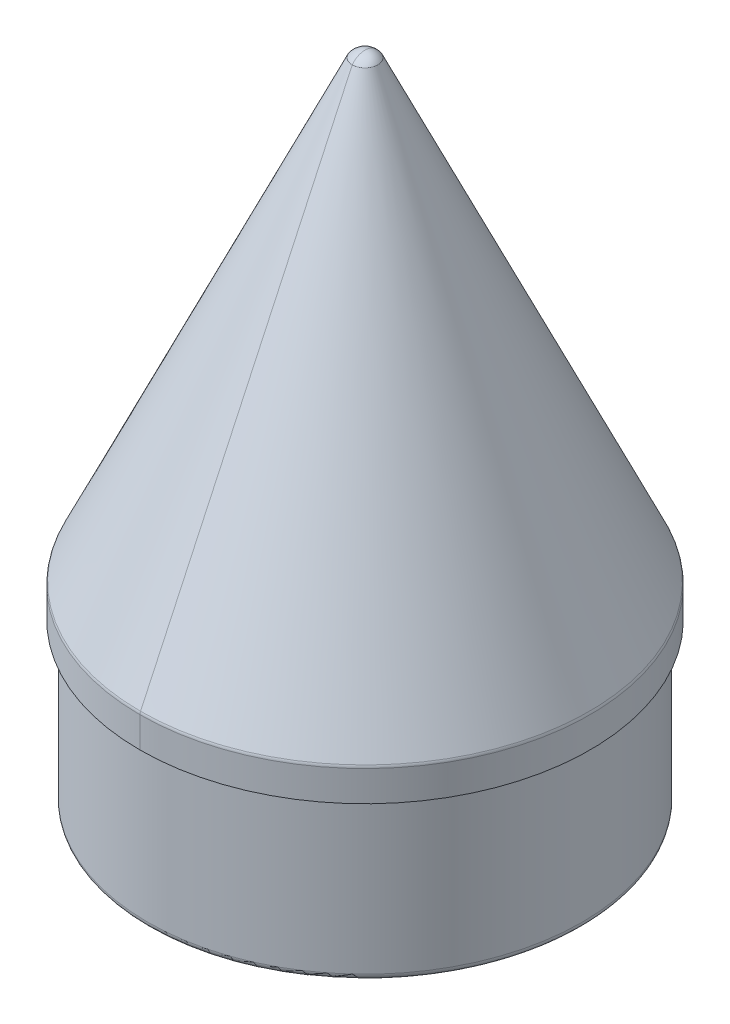
ISO-10303-21;
HEADER;
FILE_DESCRIPTION(('STEP AP214'),'2;1');
FILE_NAME('part.step','',(''),(''),'','','');
FILE_SCHEMA(('AUTOMOTIVE_DESIGN { 1 0 10303 214 1 1 1 1 }'));
ENDSEC;
DATA;
#1=APPLICATION_CONTEXT('core data for automotive mechanical design processes');
#2=APPLICATION_PROTOCOL_DEFINITION('international standard','automotive_design',2000,#1);
#3=PRODUCT_CONTEXT('',#1,'mechanical');
#4=PRODUCT('Part','Part','',(#3));
#5=PRODUCT_RELATED_PRODUCT_CATEGORY('part','',(#4));
#6=PRODUCT_DEFINITION_FORMATION('','',#4);
#7=PRODUCT_DEFINITION_CONTEXT('part definition',#1,'design');
#8=PRODUCT_DEFINITION('design','',#6,#7);
#9=PRODUCT_DEFINITION_SHAPE('','',#8);
#10=(LENGTH_UNIT() NAMED_UNIT(*) SI_UNIT(.MILLI.,.METRE.));
#11=(NAMED_UNIT(*) PLANE_ANGLE_UNIT() SI_UNIT($,.RADIAN.));
#12=(NAMED_UNIT(*) SI_UNIT($,.STERADIAN.) SOLID_ANGLE_UNIT());
#13=UNCERTAINTY_MEASURE_WITH_UNIT(LENGTH_MEASURE(1.E-05),#10,'distance_accuracy_value','');
#14=(GEOMETRIC_REPRESENTATION_CONTEXT(3) GLOBAL_UNCERTAINTY_ASSIGNED_CONTEXT((#13)) GLOBAL_UNIT_ASSIGNED_CONTEXT((#10,
#11,#12)) REPRESENTATION_CONTEXT('',''));
#15=CARTESIAN_POINT('',(0.,0.,0.));
#16=DIRECTION('',(0.,0.,1.));
#17=DIRECTION('',(1.,0.,0.));
#18=AXIS2_PLACEMENT_3D('',#15,#16,#17);
#19=CARTESIAN_POINT('',(0.,0.,0.));
#20=DIRECTION('',(1.,0.,0.));
#21=DIRECTION('',(0.,0.,-1.));
#22=AXIS2_PLACEMENT_3D('',#19,#20,#21);
#23=PLANE('',#22);
#24=DIRECTION('',(0.,-1.,0.));
#25=VECTOR('',#24,1.);
#26=CARTESIAN_POINT('',(0.,0.,70.5));
#27=LINE('',#26,#25);
#28=CARTESIAN_POINT('',(0.,0.,70.5));
#29=VERTEX_POINT('',#28);
#30=CARTESIAN_POINT('',(0.,9.55661067471414,70.5));
#31=VERTEX_POINT('',#30);
#32=EDGE_CURVE('E168',#29,#31,#27,.F.);
#33=ORIENTED_EDGE('',*,*,#32,.F.);
#34=DIRECTION('',(0.,0.,1.));
#35=VECTOR('',#34,1.);
#36=CARTESIAN_POINT('',(0.,0.,0.));
#37=LINE('',#36,#35);
#38=CARTESIAN_POINT('',(0.,0.,61.));
#39=VERTEX_POINT('',#38);
#40=EDGE_CURVE('E164',#39,#29,#37,.T.);
#41=ORIENTED_EDGE('',*,*,#40,.F.);
#42=DIRECTION('',(0.,-1.,0.));
#43=VECTOR('',#42,1.);
#44=CARTESIAN_POINT('',(0.,0.,61.));
#45=LINE('',#44,#43);
#46=CARTESIAN_POINT('',(0.,7.,61.));
#47=VERTEX_POINT('',#46);
#48=EDGE_CURVE('E137',#39,#47,#45,.F.);
#49=ORIENTED_EDGE('',*,*,#48,.T.);
#50=DIRECTION('',(0.,0.,1.));
#51=VECTOR('',#50,1.);
#52=CARTESIAN_POINT('',(0.,7.,0.));
#53=LINE('',#52,#51);
#54=CARTESIAN_POINT('',(0.,7.,63.5));
#55=VERTEX_POINT('',#54);
#56=EDGE_CURVE('E135',#47,#55,#53,.T.);
#57=ORIENTED_EDGE('',*,*,#56,.T.);
#58=DIRECTION('',(0.,-1.,0.));
#59=VECTOR('',#58,1.);
#60=CARTESIAN_POINT('',(0.,0.,63.5));
#61=LINE('',#60,#59);
#62=CARTESIAN_POINT('',(0.,8.44813736149946,63.5));
#63=VERTEX_POINT('',#62);
#64=EDGE_CURVE('E122',#55,#63,#61,.F.);
#65=ORIENTED_EDGE('',*,*,#64,.T.);
#66=DIRECTION('',(0.,-0.906307787036652,0.422618261740694));
#67=VECTOR('',#66,1.);
#68=CARTESIAN_POINT('',(0.,144.624326813859,0.));
#69=LINE('',#68,#67);
#70=CARTESIAN_POINT('',(0.,144.624326813859,0.));
#71=VERTEX_POINT('',#70);
#72=EDGE_CURVE('E115',#63,#71,#69,.F.);
#73=ORIENTED_EDGE('',*,*,#72,.T.);
#74=DIRECTION('',(0.,0.906307787036652,0.422618261740694));
#75=VECTOR('',#74,1.);
#76=CARTESIAN_POINT('',(0.,144.624326813859,0.));
#77=LINE('',#76,#75);
#78=CARTESIAN_POINT('',(0.,8.44813736149946,-63.5));
#79=VERTEX_POINT('',#78);
#80=EDGE_CURVE('E118',#71,#79,#77,.F.);
#81=ORIENTED_EDGE('',*,*,#80,.T.);
#82=DIRECTION('',(0.,-1.,0.));
#83=VECTOR('',#82,1.);
#84=CARTESIAN_POINT('',(0.,0.,-63.5));
#85=LINE('',#84,#83);
#86=CARTESIAN_POINT('',(0.,7.,-63.5));
#87=VERTEX_POINT('',#86);
#88=EDGE_CURVE('E129',#79,#87,#85,.T.);
#89=ORIENTED_EDGE('',*,*,#88,.T.);
#90=CARTESIAN_POINT('',(0.,7.,-61.));
#91=VERTEX_POINT('',#90);
#92=EDGE_CURVE('E134',#87,#91,#53,.T.);
#93=ORIENTED_EDGE('',*,*,#92,.T.);
#94=DIRECTION('',(0.,-1.,0.));
#95=VECTOR('',#94,1.);
#96=CARTESIAN_POINT('',(0.,0.,-61.));
#97=LINE('',#96,#95);
#98=CARTESIAN_POINT('',(0.,0.,-61.));
#99=VERTEX_POINT('',#98);
#100=EDGE_CURVE('E140',#91,#99,#97,.T.);
#101=ORIENTED_EDGE('',*,*,#100,.T.);
#102=CARTESIAN_POINT('',(0.,0.,-70.5));
#103=VERTEX_POINT('',#102);
#104=EDGE_CURVE('E124',#103,#99,#37,.T.);
#105=ORIENTED_EDGE('',*,*,#104,.F.);
#106=DIRECTION('',(0.,-1.,0.));
#107=VECTOR('',#106,1.);
#108=CARTESIAN_POINT('',(0.,0.,-70.5));
#109=LINE('',#108,#107);
#110=CARTESIAN_POINT('',(0.,9.55661067471414,-70.5));
#111=VERTEX_POINT('',#110);
#112=EDGE_CURVE('E171',#111,#103,#109,.T.);
#113=ORIENTED_EDGE('',*,*,#112,.F.);
#114=CARTESIAN_POINT('',(0.,9.55661067471414,-68.5));
#115=DIRECTION('',(1.,0.,0.));
#116=DIRECTION('',(0.,0.,-1.));
#117=AXIS2_PLACEMENT_3D('',#114,#115,#116);
#118=CIRCLE('',#117,2.);
#119=CARTESIAN_POINT('',(0.,10.4018471981955,-70.3126155740733));
#120=VERTEX_POINT('',#119);
#121=EDGE_CURVE('E181',#120,#111,#118,.F.);
#122=ORIENTED_EDGE('',*,*,#121,.F.);
#123=DIRECTION('',(0.,0.906307787036652,0.422618261740694));
#124=VECTOR('',#123,1.);
#125=CARTESIAN_POINT('',(0.,161.187737895926,0.));
#126=LINE('',#125,#124);
#127=CARTESIAN_POINT('',(0.,152.609710213888,-4.));
#128=VERTEX_POINT('',#127);
#129=EDGE_CURVE('E185',#128,#120,#126,.F.);
#130=ORIENTED_EDGE('',*,*,#129,.F.);
#131=CARTESIAN_POINT('',(0.,149.609710213888,0.));
#132=DIRECTION('',(1.,0.,0.));
#133=DIRECTION('',(0.,0.,-1.));
#134=AXIS2_PLACEMENT_3D('',#131,#132,#133);
#135=CIRCLE('',#134,5.00000000000003);
#136=CARTESIAN_POINT('',(0.,152.609710213888,4.));
#137=VERTEX_POINT('',#136);
#138=EDGE_CURVE('E64',#137,#128,#135,.F.);
#139=ORIENTED_EDGE('',*,*,#138,.F.);
#140=DIRECTION('',(0.,-0.906307787036652,0.422618261740694));
#141=VECTOR('',#140,1.);
#142=CARTESIAN_POINT('',(0.,161.187737895926,0.));
#143=LINE('',#142,#141);
#144=CARTESIAN_POINT('',(0.,10.4018471981955,70.3126155740733));
#145=VERTEX_POINT('',#144);
#146=EDGE_CURVE('E183',#145,#137,#143,.F.);
#147=ORIENTED_EDGE('',*,*,#146,.F.);
#148=CARTESIAN_POINT('',(0.,9.55661067471414,68.5));
#149=DIRECTION('',(1.,0.,0.));
#150=DIRECTION('',(0.,0.,-1.));
#151=AXIS2_PLACEMENT_3D('',#148,#149,#150);
#152=CIRCLE('',#151,2.);
#153=EDGE_CURVE('E173',#31,#145,#152,.F.);
#154=ORIENTED_EDGE('',*,*,#153,.F.);
#155=EDGE_LOOP('',(#33,#41,#49,#57,#65,#73,#81,#89,#93,#101,#105,#113,#122,#130,#139,#147,#154));
#156=FACE_BOUND('',#155,.T.);
#157=ADVANCED_FACE('F50',(#156),#23,.T.);
#158=CARTESIAN_POINT('',(0.,0.,0.));
#159=DIRECTION('',(0.,-1.,0.));
#160=DIRECTION('',(0.,0.,-1.));
#161=AXIS2_PLACEMENT_3D('',#158,#159,#160);
#162=PLANE('',#161);
#163=CARTESIAN_POINT('',(0.,0.,0.));
#164=DIRECTION('',(0.,-1.,0.));
#165=DIRECTION('',(0.,0.,-1.));
#166=AXIS2_PLACEMENT_3D('',#163,#164,#165);
#167=CIRCLE('',#166,70.5);
#168=EDGE_CURVE('E58',#29,#103,#167,.T.);
#169=ORIENTED_EDGE('',*,*,#168,.T.);
#170=ORIENTED_EDGE('',*,*,#104,.T.);
#171=CARTESIAN_POINT('',(0.,0.,0.));
#172=DIRECTION('',(0.,-1.,0.));
#173=DIRECTION('',(0.,0.,-1.));
#174=AXIS2_PLACEMENT_3D('',#171,#172,#173);
#175=CIRCLE('',#174,61.);
#176=EDGE_CURVE('E13',#99,#39,#175,.F.);
#177=ORIENTED_EDGE('',*,*,#176,.T.);
#178=ORIENTED_EDGE('',*,*,#40,.T.);
#179=EDGE_LOOP('',(#169,#170,#177,#178));
#180=FACE_BOUND('',#179,.T.);
#181=ADVANCED_FACE('F161',(#180),#162,.T.);
#182=CARTESIAN_POINT('',(0.,0.,0.));
#183=DIRECTION('',(0.,-1.,0.));
#184=DIRECTION('',(0.,0.,-1.));
#185=AXIS2_PLACEMENT_3D('',#182,#183,#184);
#186=CYLINDRICAL_SURFACE('',#185,70.5);
#187=ORIENTED_EDGE('',*,*,#168,.F.);
#188=ORIENTED_EDGE('',*,*,#32,.T.);
#189=CARTESIAN_POINT('',(0.,9.55661067471414,0.));
#190=DIRECTION('',(0.,-1.,0.));
#191=DIRECTION('',(0.,0.,-1.));
#192=AXIS2_PLACEMENT_3D('',#189,#190,#191);
#193=CIRCLE('',#192,70.5);
#194=EDGE_CURVE('E154',#31,#111,#193,.T.);
#195=ORIENTED_EDGE('',*,*,#194,.T.);
#196=ORIENTED_EDGE('',*,*,#112,.T.);
#197=EDGE_LOOP('',(#187,#188,#195,#196));
#198=FACE_BOUND('',#197,.T.);
#199=ADVANCED_FACE('F167',(#198),#186,.T.);
#200=CARTESIAN_POINT('',(0.,9.55661067471414,0.));
#201=DIRECTION('',(0.,-1.,0.));
#202=DIRECTION('',(0.,0.,-1.));
#203=AXIS2_PLACEMENT_3D('',#200,#201,#202);
#204=TOROIDAL_SURFACE('',#203,68.5,2.);
#205=ORIENTED_EDGE('',*,*,#194,.F.);
#206=ORIENTED_EDGE('',*,*,#153,.T.);
#207=CARTESIAN_POINT('',(0.,10.4018471981955,0.));
#208=DIRECTION('',(0.,-1.,0.));
#209=DIRECTION('',(0.,0.,-1.));
#210=AXIS2_PLACEMENT_3D('',#207,#208,#209);
#211=CIRCLE('',#210,70.3126155740733);
#212=EDGE_CURVE('E151',#145,#120,#211,.T.);
#213=ORIENTED_EDGE('',*,*,#212,.T.);
#214=ORIENTED_EDGE('',*,*,#121,.T.);
#215=EDGE_LOOP('',(#205,#206,#213,#214));
#216=FACE_BOUND('',#215,.T.);
#217=ADVANCED_FACE('F191',(#216),#204,.T.);
#218=CARTESIAN_POINT('',(0.,10.4018471981955,0.));
#219=DIRECTION('',(0.,-1.,0.));
#220=DIRECTION('',(0.,0.,-1.));
#221=AXIS2_PLACEMENT_3D('',#218,#219,#220);
#222=CONICAL_SURFACE('',#221,70.3126155740733,0.436332312998576);
#223=ORIENTED_EDGE('',*,*,#212,.F.);
#224=ORIENTED_EDGE('',*,*,#146,.T.);
#225=CARTESIAN_POINT('',(0.,152.609710213888,0.));
#226=DIRECTION('',(0.,-1.,0.));
#227=DIRECTION('',(0.,0.,-1.));
#228=AXIS2_PLACEMENT_3D('',#225,#226,#227);
#229=CIRCLE('',#228,4.);
#230=EDGE_CURVE('E148',#137,#128,#229,.T.);
#231=ORIENTED_EDGE('',*,*,#230,.T.);
#232=ORIENTED_EDGE('',*,*,#129,.T.);
#233=EDGE_LOOP('',(#223,#224,#231,#232));
#234=FACE_BOUND('',#233,.T.);
#235=ADVANCED_FACE('F189',(#234),#222,.T.);
#236=CARTESIAN_POINT('',(0.,149.609710213888,0.));
#237=DIRECTION('',(0.,-1.,0.));
#238=DIRECTION('',(1.,0.,0.));
#239=AXIS2_PLACEMENT_3D('',#236,#237,#238);
#240=SPHERICAL_SURFACE('',#239,5.00000000000003);
#241=ORIENTED_EDGE('',*,*,#230,.F.);
#242=ORIENTED_EDGE('',*,*,#138,.T.);
#243=EDGE_LOOP('',(#241,#242));
#244=FACE_BOUND('',#243,.T.);
#245=ADVANCED_FACE('F52',(#244),#240,.T.);
#246=CARTESIAN_POINT('',(0.,7.44351936601067,0.));
#247=DIRECTION('',(0.,-1.,0.));
#248=DIRECTION('',(0.,0.,-1.));
#249=AXIS2_PLACEMENT_3D('',#246,#247,#248);
#250=CONICAL_SURFACE('',#249,63.9684610648167,0.436332312998576);
#251=ORIENTED_EDGE('',*,*,#72,.F.);
#252=CARTESIAN_POINT('',(0.,8.44813736149946,0.));
#253=DIRECTION('',(0.,-1.,0.));
#254=DIRECTION('',(0.,0.,-1.));
#255=AXIS2_PLACEMENT_3D('',#252,#253,#254);
#256=CIRCLE('',#255,63.5);
#257=EDGE_CURVE('E127',#63,#79,#256,.T.);
#258=ORIENTED_EDGE('',*,*,#257,.T.);
#259=ORIENTED_EDGE('',*,*,#80,.F.);
#260=EDGE_LOOP('',(#251,#258,#259));
#261=FACE_BOUND('',#260,.T.);
#262=ADVANCED_FACE('F126',(#261),#250,.F.);
#263=CARTESIAN_POINT('',(0.,0.,0.));
#264=DIRECTION('',(0.,-1.,0.));
#265=DIRECTION('',(0.,0.,-1.));
#266=AXIS2_PLACEMENT_3D('',#263,#264,#265);
#267=CYLINDRICAL_SURFACE('',#266,63.5);
#268=ORIENTED_EDGE('',*,*,#64,.F.);
#269=CARTESIAN_POINT('',(0.,7.,0.));
#270=DIRECTION('',(0.,-1.,0.));
#271=DIRECTION('',(0.,0.,-1.));
#272=AXIS2_PLACEMENT_3D('',#269,#270,#271);
#273=CIRCLE('',#272,63.5);
#274=EDGE_CURVE('E144',#55,#87,#273,.T.);
#275=ORIENTED_EDGE('',*,*,#274,.T.);
#276=ORIENTED_EDGE('',*,*,#88,.F.);
#277=ORIENTED_EDGE('',*,*,#257,.F.);
#278=EDGE_LOOP('',(#268,#275,#276,#277));
#279=FACE_BOUND('',#278,.T.);
#280=ADVANCED_FACE('F197',(#279),#267,.F.);
#281=CARTESIAN_POINT('',(68.,7.,0.));
#282=DIRECTION('',(0.,-1.,0.));
#283=DIRECTION('',(0.,0.,-1.));
#284=AXIS2_PLACEMENT_3D('',#281,#282,#283);
#285=PLANE('',#284);
#286=ORIENTED_EDGE('',*,*,#92,.F.);
#287=ORIENTED_EDGE('',*,*,#274,.F.);
#288=ORIENTED_EDGE('',*,*,#56,.F.);
#289=CARTESIAN_POINT('',(0.,7.,0.));
#290=DIRECTION('',(0.,-1.,0.));
#291=DIRECTION('',(0.,0.,-1.));
#292=AXIS2_PLACEMENT_3D('',#289,#290,#291);
#293=CIRCLE('',#292,61.);
#294=EDGE_CURVE('E146',#47,#91,#293,.T.);
#295=ORIENTED_EDGE('',*,*,#294,.T.);
#296=EDGE_LOOP('',(#286,#287,#288,#295));
#297=FACE_BOUND('',#296,.T.);
#298=ADVANCED_FACE('F210',(#297),#285,.F.);
#299=CARTESIAN_POINT('',(0.,0.,0.));
#300=DIRECTION('',(0.,-1.,0.));
#301=DIRECTION('',(0.,0.,-1.));
#302=AXIS2_PLACEMENT_3D('',#299,#300,#301);
#303=CYLINDRICAL_SURFACE('',#302,61.);
#304=ORIENTED_EDGE('',*,*,#48,.F.);
#305=ORIENTED_EDGE('',*,*,#176,.F.);
#306=ORIENTED_EDGE('',*,*,#100,.F.);
#307=ORIENTED_EDGE('',*,*,#294,.F.);
#308=EDGE_LOOP('',(#304,#305,#306,#307));
#309=FACE_BOUND('',#308,.T.);
#310=ADVANCED_FACE('F207',(#309),#303,.F.);
#311=CLOSED_SHELL('',(#157,#181,#199,#217,#235,#245,#262,#280,#298,#310));
#312=MANIFOLD_SOLID_BREP('B2',#311);
#313=CARTESIAN_POINT('',(0.,0.,0.));
#314=DIRECTION('',(1.,0.,0.));
#315=DIRECTION('',(0.,0.,-1.));
#316=AXIS2_PLACEMENT_3D('',#313,#314,#315);
#317=PLANE('',#316);
#318=DIRECTION('',(0.,-1.,0.));
#319=VECTOR('',#318,1.);
#320=CARTESIAN_POINT('',(0.,0.,70.5));
#321=LINE('',#320,#319);
#322=CARTESIAN_POINT('',(0.,0.,70.5));
#323=VERTEX_POINT('',#322);
#324=CARTESIAN_POINT('',(0.,9.55661067471414,70.5));
#325=VERTEX_POINT('',#324);
#326=EDGE_CURVE('E313',#323,#325,#321,.F.);
#327=ORIENTED_EDGE('',*,*,#326,.T.);
#328=CARTESIAN_POINT('',(0.,9.55661067471414,68.5));
#329=DIRECTION('',(1.,0.,0.));
#330=DIRECTION('',(0.,0.,-1.));
#331=AXIS2_PLACEMENT_3D('',#328,#329,#330);
#332=CIRCLE('',#331,2.);
#333=CARTESIAN_POINT('',(0.,10.4018471981955,70.3126155740733));
#334=VERTEX_POINT('',#333);
#335=EDGE_CURVE('E403',#325,#334,#332,.F.);
#336=ORIENTED_EDGE('',*,*,#335,.T.);
#337=DIRECTION('',(0.,-0.906307787036652,0.422618261740694));
#338=VECTOR('',#337,1.);
#339=CARTESIAN_POINT('',(0.,161.187737895926,0.));
#340=LINE('',#339,#338);
#341=CARTESIAN_POINT('',(0.,152.609710213888,4.));
#342=VERTEX_POINT('',#341);
#343=EDGE_CURVE('E407',#334,#342,#340,.F.);
#344=ORIENTED_EDGE('',*,*,#343,.T.);
#345=CARTESIAN_POINT('',(0.,149.609710213888,0.));
#346=DIRECTION('',(1.,0.,0.));
#347=DIRECTION('',(0.,0.,-1.));
#348=AXIS2_PLACEMENT_3D('',#345,#346,#347);
#349=CIRCLE('',#348,5.00000000000003);
#350=CARTESIAN_POINT('',(0.,152.609710213888,-4.));
#351=VERTEX_POINT('',#350);
#352=EDGE_CURVE('E48',#342,#351,#349,.F.);
#353=ORIENTED_EDGE('',*,*,#352,.T.);
#354=DIRECTION('',(0.,0.906307787036652,0.422618261740694));
#355=VECTOR('',#354,1.);
#356=CARTESIAN_POINT('',(0.,161.187737895926,0.));
#357=LINE('',#356,#355);
#358=CARTESIAN_POINT('',(0.,10.4018471981955,-70.3126155740733));
#359=VERTEX_POINT('',#358);
#360=EDGE_CURVE('E318',#351,#359,#357,.F.);
#361=ORIENTED_EDGE('',*,*,#360,.T.);
#362=CARTESIAN_POINT('',(0.,9.55661067471414,-68.5));
#363=DIRECTION('',(1.,0.,0.));
#364=DIRECTION('',(0.,0.,-1.));
#365=AXIS2_PLACEMENT_3D('',#362,#363,#364);
#366=CIRCLE('',#365,2.);
#367=CARTESIAN_POINT('',(0.,9.55661067471414,-70.5));
#368=VERTEX_POINT('',#367);
#369=EDGE_CURVE('E404',#359,#368,#366,.F.);
#370=ORIENTED_EDGE('',*,*,#369,.T.);
#371=DIRECTION('',(0.,-1.,0.));
#372=VECTOR('',#371,1.);
#373=CARTESIAN_POINT('',(0.,0.,-70.5));
#374=LINE('',#373,#372);
#375=CARTESIAN_POINT('',(0.,0.,-70.5));
#376=VERTEX_POINT('',#375);
#377=EDGE_CURVE('E400',#368,#376,#374,.T.);
#378=ORIENTED_EDGE('',*,*,#377,.T.);
#379=DIRECTION('',(0.,0.,1.));
#380=VECTOR('',#379,1.);
#381=CARTESIAN_POINT('',(0.,0.,0.));
#382=LINE('',#381,#380);
#383=CARTESIAN_POINT('',(0.,0.,-61.));
#384=VERTEX_POINT('',#383);
#385=EDGE_CURVE('E387',#376,#384,#382,.T.);
#386=ORIENTED_EDGE('',*,*,#385,.T.);
#387=DIRECTION('',(0.,-1.,0.));
#388=VECTOR('',#387,1.);
#389=CARTESIAN_POINT('',(0.,0.,-61.));
#390=LINE('',#389,#388);
#391=CARTESIAN_POINT('',(0.,7.,-61.));
#392=VERTEX_POINT('',#391);
#393=EDGE_CURVE('E427',#392,#384,#390,.T.);
#394=ORIENTED_EDGE('',*,*,#393,.F.);
#395=DIRECTION('',(0.,0.,1.));
#396=VECTOR('',#395,1.);
#397=CARTESIAN_POINT('',(0.,7.,0.));
#398=LINE('',#397,#396);
#399=CARTESIAN_POINT('',(0.,7.,-63.5));
#400=VERTEX_POINT('',#399);
#401=EDGE_CURVE('E439',#400,#392,#398,.T.);
#402=ORIENTED_EDGE('',*,*,#401,.F.);
#403=DIRECTION('',(0.,-1.,0.));
#404=VECTOR('',#403,1.);
#405=CARTESIAN_POINT('',(0.,0.,-63.5));
#406=LINE('',#405,#404);
#407=CARTESIAN_POINT('',(0.,8.44813736149946,-63.5));
#408=VERTEX_POINT('',#407);
#409=EDGE_CURVE('E391',#408,#400,#406,.T.);
#410=ORIENTED_EDGE('',*,*,#409,.F.);
#411=DIRECTION('',(0.,0.906307787036652,0.422618261740694));
#412=VECTOR('',#411,1.);
#413=CARTESIAN_POINT('',(0.,144.624326813859,0.));
#414=LINE('',#413,#412);
#415=CARTESIAN_POINT('',(0.,144.624326813859,0.));
#416=VERTEX_POINT('',#415);
#417=EDGE_CURVE('E381',#416,#408,#414,.F.);
#418=ORIENTED_EDGE('',*,*,#417,.F.);
#419=DIRECTION('',(0.,-0.906307787036652,0.422618261740694));
#420=VECTOR('',#419,1.);
#421=CARTESIAN_POINT('',(0.,144.624326813859,0.));
#422=LINE('',#421,#420);
#423=CARTESIAN_POINT('',(0.,8.44813736149946,63.5));
#424=VERTEX_POINT('',#423);
#425=EDGE_CURVE('E378',#424,#416,#422,.F.);
#426=ORIENTED_EDGE('',*,*,#425,.F.);
#427=DIRECTION('',(0.,-1.,0.));
#428=VECTOR('',#427,1.);
#429=CARTESIAN_POINT('',(0.,0.,63.5));
#430=LINE('',#429,#428);
#431=CARTESIAN_POINT('',(0.,7.,63.5));
#432=VERTEX_POINT('',#431);
#433=EDGE_CURVE('E392',#432,#424,#430,.F.);
#434=ORIENTED_EDGE('',*,*,#433,.F.);
#435=CARTESIAN_POINT('',(0.,7.,61.));
#436=VERTEX_POINT('',#435);
#437=EDGE_CURVE('E438',#436,#432,#398,.T.);
#438=ORIENTED_EDGE('',*,*,#437,.F.);
#439=DIRECTION('',(0.,-1.,0.));
#440=VECTOR('',#439,1.);
#441=CARTESIAN_POINT('',(0.,0.,61.));
#442=LINE('',#441,#440);
#443=CARTESIAN_POINT('',(0.,0.,61.));
#444=VERTEX_POINT('',#443);
#445=EDGE_CURVE('E437',#444,#436,#442,.F.);
#446=ORIENTED_EDGE('',*,*,#445,.F.);
#447=EDGE_CURVE('E398',#444,#323,#382,.T.);
#448=ORIENTED_EDGE('',*,*,#447,.T.);
#449=EDGE_LOOP('',(#327,#336,#344,#353,#361,#370,#378,#386,#394,#402,#410,#418,#426,#434,#438,
#446,#448));
#450=FACE_BOUND('',#449,.T.);
#451=ADVANCED_FACE('F310',(#450),#317,.F.);
#452=CARTESIAN_POINT('',(0.,7.44351936601067,0.));
#453=DIRECTION('',(0.,-1.,0.));
#454=DIRECTION('',(0.,0.,-1.));
#455=AXIS2_PLACEMENT_3D('',#452,#453,#454);
#456=CONICAL_SURFACE('',#455,63.9684610648167,0.436332312998576);
#457=CARTESIAN_POINT('',(0.,8.44813736149946,0.));
#458=DIRECTION('',(0.,-1.,0.));
#459=DIRECTION('',(0.,0.,-1.));
#460=AXIS2_PLACEMENT_3D('',#457,#458,#459);
#461=CIRCLE('',#460,63.5);
#462=EDGE_CURVE('E384',#408,#424,#461,.T.);
#463=ORIENTED_EDGE('',*,*,#462,.T.);
#464=ORIENTED_EDGE('',*,*,#425,.T.);
#465=ORIENTED_EDGE('',*,*,#417,.T.);
#466=EDGE_LOOP('',(#463,#464,#465));
#467=FACE_BOUND('',#466,.T.);
#468=ADVANCED_FACE('F380',(#467),#456,.F.);
#469=CARTESIAN_POINT('',(0.,0.,0.));
#470=DIRECTION('',(0.,-1.,0.));
#471=DIRECTION('',(0.,0.,-1.));
#472=AXIS2_PLACEMENT_3D('',#469,#470,#471);
#473=CYLINDRICAL_SURFACE('',#472,63.5);
#474=CARTESIAN_POINT('',(0.,7.,0.));
#475=DIRECTION('',(0.,-1.,0.));
#476=DIRECTION('',(0.,0.,-1.));
#477=AXIS2_PLACEMENT_3D('',#474,#475,#476);
#478=CIRCLE('',#477,63.5);
#479=EDGE_CURVE('E428',#400,#432,#478,.T.);
#480=ORIENTED_EDGE('',*,*,#479,.T.);
#481=ORIENTED_EDGE('',*,*,#433,.T.);
#482=ORIENTED_EDGE('',*,*,#462,.F.);
#483=ORIENTED_EDGE('',*,*,#409,.T.);
#484=EDGE_LOOP('',(#480,#481,#482,#483));
#485=FACE_BOUND('',#484,.T.);
#486=ADVANCED_FACE('F448',(#485),#473,.F.);
#487=CARTESIAN_POINT('',(68.,7.,0.));
#488=DIRECTION('',(0.,-1.,0.));
#489=DIRECTION('',(0.,0.,-1.));
#490=AXIS2_PLACEMENT_3D('',#487,#488,#489);
#491=PLANE('',#490);
#492=ORIENTED_EDGE('',*,*,#479,.F.);
#493=ORIENTED_EDGE('',*,*,#401,.T.);
#494=CARTESIAN_POINT('',(0.,7.,0.));
#495=DIRECTION('',(0.,-1.,0.));
#496=DIRECTION('',(0.,0.,-1.));
#497=AXIS2_PLACEMENT_3D('',#494,#495,#496);
#498=CIRCLE('',#497,61.);
#499=EDGE_CURVE('E420',#392,#436,#498,.T.);
#500=ORIENTED_EDGE('',*,*,#499,.T.);
#501=ORIENTED_EDGE('',*,*,#437,.T.);
#502=EDGE_LOOP('',(#492,#493,#500,#501));
#503=FACE_BOUND('',#502,.T.);
#504=ADVANCED_FACE('F444',(#503),#491,.F.);
#505=CARTESIAN_POINT('',(0.,0.,0.));
#506=DIRECTION('',(0.,-1.,0.));
#507=DIRECTION('',(0.,0.,-1.));
#508=AXIS2_PLACEMENT_3D('',#505,#506,#507);
#509=PLANE('',#508);
#510=ORIENTED_EDGE('',*,*,#385,.F.);
#511=CARTESIAN_POINT('',(0.,0.,0.));
#512=DIRECTION('',(0.,-1.,0.));
#513=DIRECTION('',(0.,0.,-1.));
#514=AXIS2_PLACEMENT_3D('',#511,#512,#513);
#515=CIRCLE('',#514,70.5);
#516=EDGE_CURVE('E422',#376,#323,#515,.T.);
#517=ORIENTED_EDGE('',*,*,#516,.T.);
#518=ORIENTED_EDGE('',*,*,#447,.F.);
#519=CARTESIAN_POINT('',(0.,0.,0.));
#520=DIRECTION('',(0.,-1.,0.));
#521=DIRECTION('',(0.,0.,-1.));
#522=AXIS2_PLACEMENT_3D('',#519,#520,#521);
#523=CIRCLE('',#522,61.);
#524=EDGE_CURVE('E433',#444,#384,#523,.F.);
#525=ORIENTED_EDGE('',*,*,#524,.T.);
#526=EDGE_LOOP('',(#510,#517,#518,#525));
#527=FACE_BOUND('',#526,.T.);
#528=ADVANCED_FACE('F458',(#527),#509,.T.);
#529=CARTESIAN_POINT('',(0.,0.,0.));
#530=DIRECTION('',(0.,-1.,0.));
#531=DIRECTION('',(0.,0.,-1.));
#532=AXIS2_PLACEMENT_3D('',#529,#530,#531);
#533=CYLINDRICAL_SURFACE('',#532,61.);
#534=ORIENTED_EDGE('',*,*,#524,.F.);
#535=ORIENTED_EDGE('',*,*,#445,.T.);
#536=ORIENTED_EDGE('',*,*,#499,.F.);
#537=ORIENTED_EDGE('',*,*,#393,.T.);
#538=EDGE_LOOP('',(#534,#535,#536,#537));
#539=FACE_BOUND('',#538,.T.);
#540=ADVANCED_FACE('F452',(#539),#533,.F.);
#541=CARTESIAN_POINT('',(0.,0.,0.));
#542=DIRECTION('',(0.,-1.,0.));
#543=DIRECTION('',(0.,0.,-1.));
#544=AXIS2_PLACEMENT_3D('',#541,#542,#543);
#545=CYLINDRICAL_SURFACE('',#544,70.5);
#546=ORIENTED_EDGE('',*,*,#326,.F.);
#547=ORIENTED_EDGE('',*,*,#516,.F.);
#548=ORIENTED_EDGE('',*,*,#377,.F.);
#549=CARTESIAN_POINT('',(0.,9.55661067471414,0.));
#550=DIRECTION('',(0.,-1.,0.));
#551=DIRECTION('',(0.,0.,-1.));
#552=AXIS2_PLACEMENT_3D('',#549,#550,#551);
#553=CIRCLE('',#552,70.5);
#554=EDGE_CURVE('E418',#368,#325,#553,.T.);
#555=ORIENTED_EDGE('',*,*,#554,.T.);
#556=EDGE_LOOP('',(#546,#547,#548,#555));
#557=FACE_BOUND('',#556,.T.);
#558=ADVANCED_FACE('F457',(#557),#545,.T.);
#559=CARTESIAN_POINT('',(0.,9.55661067471414,0.));
#560=DIRECTION('',(0.,-1.,0.));
#561=DIRECTION('',(0.,0.,-1.));
#562=AXIS2_PLACEMENT_3D('',#559,#560,#561);
#563=TOROIDAL_SURFACE('',#562,68.5,2.);
#564=ORIENTED_EDGE('',*,*,#335,.F.);
#565=ORIENTED_EDGE('',*,*,#554,.F.);
#566=ORIENTED_EDGE('',*,*,#369,.F.);
#567=CARTESIAN_POINT('',(0.,10.4018471981955,0.));
#568=DIRECTION('',(0.,-1.,0.));
#569=DIRECTION('',(0.,0.,-1.));
#570=AXIS2_PLACEMENT_3D('',#567,#568,#569);
#571=CIRCLE('',#570,70.3126155740733);
#572=EDGE_CURVE('E415',#359,#334,#571,.T.);
#573=ORIENTED_EDGE('',*,*,#572,.T.);
#574=EDGE_LOOP('',(#564,#565,#566,#573));
#575=FACE_BOUND('',#574,.T.);
#576=ADVANCED_FACE('F416',(#575),#563,.T.);
#577=CARTESIAN_POINT('',(0.,10.4018471981955,0.));
#578=DIRECTION('',(0.,-1.,0.));
#579=DIRECTION('',(0.,0.,-1.));
#580=AXIS2_PLACEMENT_3D('',#577,#578,#579);
#581=CONICAL_SURFACE('',#580,70.3126155740733,0.436332312998576);
#582=ORIENTED_EDGE('',*,*,#343,.F.);
#583=ORIENTED_EDGE('',*,*,#572,.F.);
#584=ORIENTED_EDGE('',*,*,#360,.F.);
#585=CARTESIAN_POINT('',(0.,152.609710213888,0.));
#586=DIRECTION('',(0.,-1.,0.));
#587=DIRECTION('',(0.,0.,-1.));
#588=AXIS2_PLACEMENT_3D('',#585,#586,#587);
#589=CIRCLE('',#588,4.);
#590=EDGE_CURVE('E417',#351,#342,#589,.T.);
#591=ORIENTED_EDGE('',*,*,#590,.T.);
#592=EDGE_LOOP('',(#582,#583,#584,#591));
#593=FACE_BOUND('',#592,.T.);
#594=ADVANCED_FACE('F460',(#593),#581,.T.);
#595=CARTESIAN_POINT('',(0.,149.609710213888,0.));
#596=DIRECTION('',(0.,-1.,0.));
#597=DIRECTION('',(1.,0.,0.));
#598=AXIS2_PLACEMENT_3D('',#595,#596,#597);
#599=SPHERICAL_SURFACE('',#598,5.00000000000003);
#600=ORIENTED_EDGE('',*,*,#352,.F.);
#601=ORIENTED_EDGE('',*,*,#590,.F.);
#602=EDGE_LOOP('',(#600,#601));
#603=FACE_BOUND('',#602,.T.);
#604=ADVANCED_FACE('F459',(#603),#599,.T.);
#605=CLOSED_SHELL('',(#451,#468,#486,#504,#528,#540,#558,#576,#594,#604));
#606=MANIFOLD_SOLID_BREP('B7',#605);
#607=CARTESIAN_POINT('',(0.,0.,0.));
#608=DIRECTION('',(0.,-1.,0.));
#609=DIRECTION('',(0.,0.,-1.));
#610=AXIS2_PLACEMENT_3D('',#607,#608,#609);
#611=PLANE('',#610);
#612=CARTESIAN_POINT('',(0.,0.,0.));
#613=DIRECTION('',(0.,-1.,0.));
#614=DIRECTION('',(0.,0.,-1.));
#615=AXIS2_PLACEMENT_3D('',#612,#613,#614);
#616=CIRCLE('',#615,61.);
#617=CARTESIAN_POINT('',(0.,0.,-61.));
#618=VERTEX_POINT('',#617);
#619=EDGE_CURVE('E309',#618,#618,#616,.F.);
#620=ORIENTED_EDGE('',*,*,#619,.F.);
#621=EDGE_LOOP('',(#620));
#622=FACE_BOUND('',#621,.T.);
#623=CARTESIAN_POINT('',(0.,0.,0.));
#624=DIRECTION('',(0.,-1.,0.));
#625=DIRECTION('',(0.,0.,-1.));
#626=AXIS2_PLACEMENT_3D('',#623,#624,#625);
#627=CIRCLE('',#626,68.);
#628=CARTESIAN_POINT('',(0.,0.,-68.));
#629=VERTEX_POINT('',#628);
#630=EDGE_CURVE('E577',#629,#629,#627,.T.);
#631=ORIENTED_EDGE('',*,*,#630,.F.);
#632=EDGE_LOOP('',(#631));
#633=FACE_BOUND('',#632,.T.);
#634=ADVANCED_FACE('F563',(#622,#633),#611,.F.);
#635=CARTESIAN_POINT('',(0.,-48.,0.));
#636=DIRECTION('',(0.,-1.,0.));
#637=DIRECTION('',(0.,0.,-1.));
#638=AXIS2_PLACEMENT_3D('',#635,#636,#637);
#639=TOROIDAL_SURFACE('',#638,66.,2.);
#640=CARTESIAN_POINT('',(0.,-48.,0.));
#641=DIRECTION('',(0.,-1.,0.));
#642=DIRECTION('',(0.,0.,-1.));
#643=AXIS2_PLACEMENT_3D('',#640,#641,#642);
#644=CIRCLE('',#643,68.);
#645=CARTESIAN_POINT('',(0.,-48.,-68.));
#646=VERTEX_POINT('',#645);
#647=EDGE_CURVE('E573',#646,#646,#644,.T.);
#648=ORIENTED_EDGE('',*,*,#647,.T.);
#649=EDGE_LOOP('',(#648));
#650=FACE_BOUND('',#649,.T.);
#651=CARTESIAN_POINT('',(0.,-50.,0.));
#652=DIRECTION('',(0.,-1.,0.));
#653=DIRECTION('',(0.,0.,-1.));
#654=AXIS2_PLACEMENT_3D('',#651,#652,#653);
#655=CIRCLE('',#654,66.);
#656=CARTESIAN_POINT('',(0.,-50.,-66.));
#657=VERTEX_POINT('',#656);
#658=EDGE_CURVE('E569',#657,#657,#655,.T.);
#659=ORIENTED_EDGE('',*,*,#658,.F.);
#660=EDGE_LOOP('',(#659));
#661=FACE_BOUND('',#660,.T.);
#662=ADVANCED_FACE('F596',(#650,#661),#639,.T.);
#663=CARTESIAN_POINT('',(0.,0.,0.));
#664=DIRECTION('',(0.,-1.,0.));
#665=DIRECTION('',(0.,0.,-1.));
#666=AXIS2_PLACEMENT_3D('',#663,#664,#665);
#667=CYLINDRICAL_SURFACE('',#666,68.);
#668=ORIENTED_EDGE('',*,*,#630,.T.);
#669=EDGE_LOOP('',(#668));
#670=FACE_BOUND('',#669,.T.);
#671=ORIENTED_EDGE('',*,*,#647,.F.);
#672=EDGE_LOOP('',(#671));
#673=FACE_BOUND('',#672,.T.);
#674=ADVANCED_FACE('F590',(#670,#673),#667,.T.);
#675=CARTESIAN_POINT('',(0.,-50.,0.));
#676=DIRECTION('',(0.,-1.,0.));
#677=DIRECTION('',(0.,0.,-1.));
#678=AXIS2_PLACEMENT_3D('',#675,#676,#677);
#679=PLANE('',#678);
#680=CARTESIAN_POINT('',(0.,-50.,0.));
#681=DIRECTION('',(0.,-1.,0.));
#682=DIRECTION('',(0.,0.,-1.));
#683=AXIS2_PLACEMENT_3D('',#680,#681,#682);
#684=CIRCLE('',#683,61.);
#685=CARTESIAN_POINT('',(0.,-50.,-61.));
#686=VERTEX_POINT('',#685);
#687=EDGE_CURVE('E582',#686,#686,#684,.T.);
#688=ORIENTED_EDGE('',*,*,#687,.F.);
#689=EDGE_LOOP('',(#688));
#690=FACE_BOUND('',#689,.T.);
#691=ORIENTED_EDGE('',*,*,#658,.T.);
#692=EDGE_LOOP('',(#691));
#693=FACE_BOUND('',#692,.T.);
#694=ADVANCED_FACE('F588',(#690,#693),#679,.T.);
#695=CARTESIAN_POINT('',(0.,0.,0.));
#696=DIRECTION('',(0.,-1.,0.));
#697=DIRECTION('',(0.,0.,-1.));
#698=AXIS2_PLACEMENT_3D('',#695,#696,#697);
#699=CYLINDRICAL_SURFACE('',#698,61.);
#700=ORIENTED_EDGE('',*,*,#619,.T.);
#701=EDGE_LOOP('',(#700));
#702=FACE_BOUND('',#701,.T.);
#703=ORIENTED_EDGE('',*,*,#687,.T.);
#704=EDGE_LOOP('',(#703));
#705=FACE_BOUND('',#704,.T.);
#706=ADVANCED_FACE('F586',(#702,#705),#699,.F.);
#707=CLOSED_SHELL('',(#634,#662,#674,#694,#706));
#708=MANIFOLD_SOLID_BREP('B42',#707);
#709=ADVANCED_BREP_SHAPE_REPRESENTATION('',(#18,#312,#606,#708),#14);
#710=SHAPE_DEFINITION_REPRESENTATION(#9,#709);
ENDSEC;
END-ISO-10303-21;
